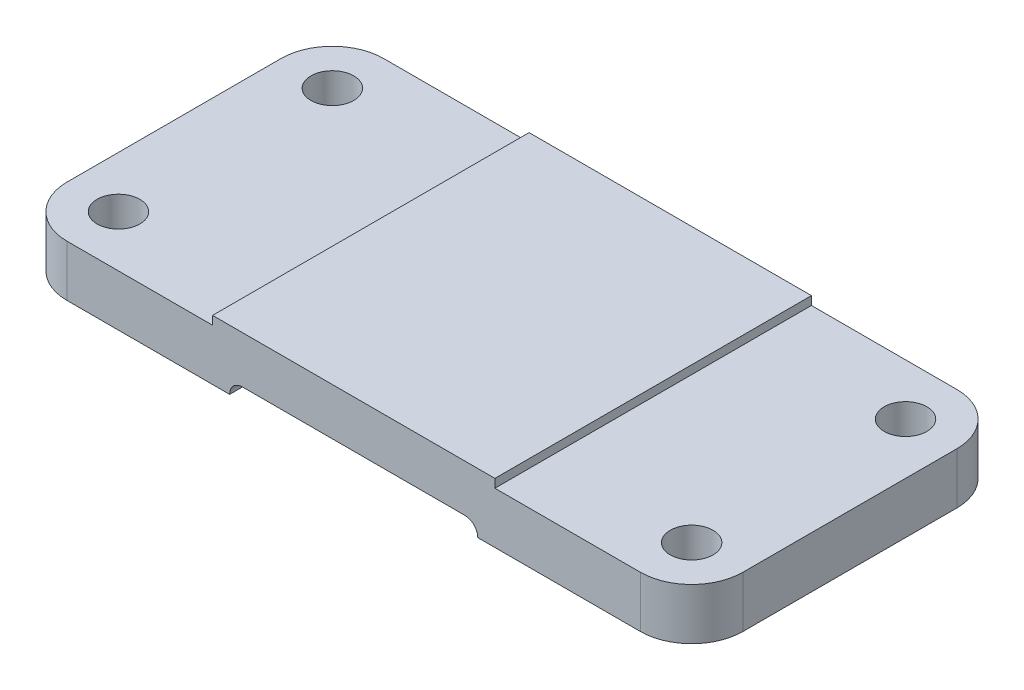
ISO-10303-21;
HEADER;
FILE_DESCRIPTION(('STEP AP214'),'2;1');
FILE_NAME('part.step','',(''),(''),'','','');
FILE_SCHEMA(('AUTOMOTIVE_DESIGN { 1 0 10303 214 1 1 1 1 }'));
ENDSEC;
DATA;
#1=APPLICATION_CONTEXT('core data for automotive mechanical design processes');
#2=APPLICATION_PROTOCOL_DEFINITION('international standard','automotive_design',2000,#1);
#3=PRODUCT_CONTEXT('',#1,'mechanical');
#4=PRODUCT('Part','Part','',(#3));
#5=PRODUCT_RELATED_PRODUCT_CATEGORY('part','',(#4));
#6=PRODUCT_DEFINITION_FORMATION('','',#4);
#7=PRODUCT_DEFINITION_CONTEXT('part definition',#1,'design');
#8=PRODUCT_DEFINITION('design','',#6,#7);
#9=PRODUCT_DEFINITION_SHAPE('','',#8);
#10=(LENGTH_UNIT() NAMED_UNIT(*) SI_UNIT(.MILLI.,.METRE.));
#11=(NAMED_UNIT(*) PLANE_ANGLE_UNIT() SI_UNIT($,.RADIAN.));
#12=(NAMED_UNIT(*) SI_UNIT($,.STERADIAN.) SOLID_ANGLE_UNIT());
#13=UNCERTAINTY_MEASURE_WITH_UNIT(LENGTH_MEASURE(1.E-05),#10,'distance_accuracy_value','');
#14=(GEOMETRIC_REPRESENTATION_CONTEXT(3) GLOBAL_UNCERTAINTY_ASSIGNED_CONTEXT((#13)) GLOBAL_UNIT_ASSIGNED_CONTEXT((#10,
#11,#12)) REPRESENTATION_CONTEXT('',''));
#15=CARTESIAN_POINT('',(0.,0.,0.));
#16=DIRECTION('',(0.,0.,1.));
#17=DIRECTION('',(1.,0.,0.));
#18=AXIS2_PLACEMENT_3D('',#15,#16,#17);
#19=CARTESIAN_POINT('',(-76.8652227671822,0.,33.9736268072995));
#20=DIRECTION('',(0.,1.,0.));
#21=DIRECTION('',(0.,0.,1.));
#22=AXIS2_PLACEMENT_3D('',#19,#20,#21);
#23=PLANE('',#22);
#24=CARTESIAN_POINT('',(57.1347772328178,0.,-16.0263731927005));
#25=DIRECTION('',(0.,1.,0.));
#26=DIRECTION('',(0.,0.,1.));
#27=AXIS2_PLACEMENT_3D('',#24,#25,#26);
#28=CIRCLE('',#27,5.00000000000001);
#29=CARTESIAN_POINT('',(57.1347772328178,0.,-11.0263731927005));
#30=VERTEX_POINT('',#29);
#31=EDGE_CURVE('E260',#30,#30,#28,.T.);
#32=ORIENTED_EDGE('',*,*,#31,.T.);
#33=EDGE_LOOP('',(#32));
#34=FACE_BOUND('',#33,.T.);
#35=CARTESIAN_POINT('',(57.1347772328178,0.,33.9736268072995));
#36=DIRECTION('',(0.,1.,0.));
#37=DIRECTION('',(0.,0.,1.));
#38=AXIS2_PLACEMENT_3D('',#35,#36,#37);
#39=CIRCLE('',#38,5.00000000000001);
#40=CARTESIAN_POINT('',(57.1347772328178,0.,38.9736268072995));
#41=VERTEX_POINT('',#40);
#42=EDGE_CURVE('E254',#41,#41,#39,.T.);
#43=ORIENTED_EDGE('',*,*,#42,.T.);
#44=EDGE_LOOP('',(#43));
#45=FACE_BOUND('',#44,.T.);
#46=DIRECTION('',(1.,0.,0.));
#47=VECTOR('',#46,1.);
#48=CARTESIAN_POINT('',(-76.8652227671821,0.,45.9736268072995));
#49=LINE('',#48,#47);
#50=CARTESIAN_POINT('',(19.1347772328178,0.,45.9736268072995));
#51=VERTEX_POINT('',#50);
#52=CARTESIAN_POINT('',(57.1347772328177,0.,45.9736268072995));
#53=VERTEX_POINT('',#52);
#54=EDGE_CURVE('E234',#51,#53,#49,.T.);
#55=ORIENTED_EDGE('',*,*,#54,.F.);
#56=DIRECTION('',(0.,0.,1.));
#57=VECTOR('',#56,1.);
#58=CARTESIAN_POINT('',(19.1347772328178,0.,45.9736268072995));
#59=LINE('',#58,#57);
#60=CARTESIAN_POINT('',(19.1347772328178,0.,-28.0263731927005));
#61=VERTEX_POINT('',#60);
#62=EDGE_CURVE('E170',#61,#51,#59,.T.);
#63=ORIENTED_EDGE('',*,*,#62,.F.);
#64=DIRECTION('',(-1.,0.,0.));
#65=VECTOR('',#64,1.);
#66=CARTESIAN_POINT('',(-76.8652227671821,0.,-28.0263731927005));
#67=LINE('',#66,#65);
#68=CARTESIAN_POINT('',(57.1347772328177,0.,-28.0263731927005));
#69=VERTEX_POINT('',#68);
#70=EDGE_CURVE('E164',#69,#61,#67,.T.);
#71=ORIENTED_EDGE('',*,*,#70,.F.);
#72=CARTESIAN_POINT('',(57.1347772328178,0.,-16.0263731927005));
#73=DIRECTION('',(0.,1.,0.));
#74=DIRECTION('',(0.,0.,1.));
#75=AXIS2_PLACEMENT_3D('',#72,#73,#74);
#76=CIRCLE('',#75,12.);
#77=CARTESIAN_POINT('',(69.1347772328178,0.,-16.0263731927004));
#78=VERTEX_POINT('',#77);
#79=EDGE_CURVE('E165',#78,#69,#76,.T.);
#80=ORIENTED_EDGE('',*,*,#79,.F.);
#81=DIRECTION('',(0.,0.,-1.));
#82=VECTOR('',#81,1.);
#83=CARTESIAN_POINT('',(69.1347772328178,0.,-16.0263731927004));
#84=LINE('',#83,#82);
#85=CARTESIAN_POINT('',(69.1347772328178,0.,33.9736268072994));
#86=VERTEX_POINT('',#85);
#87=EDGE_CURVE('E336',#86,#78,#84,.T.);
#88=ORIENTED_EDGE('',*,*,#87,.F.);
#89=CARTESIAN_POINT('',(57.1347772328178,0.,33.9736268072995));
#90=DIRECTION('',(0.,1.,0.));
#91=DIRECTION('',(0.,0.,1.));
#92=AXIS2_PLACEMENT_3D('',#89,#90,#91);
#93=CIRCLE('',#92,12.);
#94=EDGE_CURVE('E240',#53,#86,#93,.T.);
#95=ORIENTED_EDGE('',*,*,#94,.F.);
#96=EDGE_LOOP('',(#55,#63,#71,#80,#88,#95));
#97=FACE_BOUND('',#96,.T.);
#98=ADVANCED_FACE('F33',(#34,#45,#97),#23,.F.);
#99=CARTESIAN_POINT('',(-76.8652227671822,12.,33.9736268072995));
#100=DIRECTION('',(0.,1.,0.));
#101=DIRECTION('',(0.,0.,1.));
#102=AXIS2_PLACEMENT_3D('',#99,#100,#101);
#103=PLANE('',#102);
#104=CARTESIAN_POINT('',(57.1347772328178,12.,-16.0263731927005));
#105=DIRECTION('',(0.,1.,0.));
#106=DIRECTION('',(0.,0.,1.));
#107=AXIS2_PLACEMENT_3D('',#104,#105,#106);
#108=CIRCLE('',#107,5.00000000000001);
#109=CARTESIAN_POINT('',(57.1347772328178,12.,-11.0263731927005));
#110=VERTEX_POINT('',#109);
#111=EDGE_CURVE('E263',#110,#110,#108,.T.);
#112=ORIENTED_EDGE('',*,*,#111,.F.);
#113=EDGE_LOOP('',(#112));
#114=FACE_BOUND('',#113,.T.);
#115=CARTESIAN_POINT('',(57.1347772328178,12.,33.9736268072995));
#116=DIRECTION('',(0.,1.,0.));
#117=DIRECTION('',(0.,0.,1.));
#118=AXIS2_PLACEMENT_3D('',#115,#116,#117);
#119=CIRCLE('',#118,5.00000000000001);
#120=CARTESIAN_POINT('',(57.1347772328178,12.,38.9736268072995));
#121=VERTEX_POINT('',#120);
#122=EDGE_CURVE('E257',#121,#121,#119,.T.);
#123=ORIENTED_EDGE('',*,*,#122,.F.);
#124=EDGE_LOOP('',(#123));
#125=FACE_BOUND('',#124,.T.);
#126=DIRECTION('',(0.,0.,-1.));
#127=VECTOR('',#126,1.);
#128=CARTESIAN_POINT('',(23.1347772328178,12.,45.9736268072995));
#129=LINE('',#128,#127);
#130=CARTESIAN_POINT('',(23.1347772328178,12.,45.9736268072995));
#131=VERTEX_POINT('',#130);
#132=CARTESIAN_POINT('',(23.1347772328178,12.,-28.0263731927005));
#133=VERTEX_POINT('',#132);
#134=EDGE_CURVE('E184',#131,#133,#129,.T.);
#135=ORIENTED_EDGE('',*,*,#134,.F.);
#136=DIRECTION('',(1.,0.,0.));
#137=VECTOR('',#136,1.);
#138=CARTESIAN_POINT('',(-76.8652227671821,12.,45.9736268072995));
#139=LINE('',#138,#137);
#140=CARTESIAN_POINT('',(57.1347772328177,12.,45.9736268072995));
#141=VERTEX_POINT('',#140);
#142=EDGE_CURVE('E278',#131,#141,#139,.T.);
#143=ORIENTED_EDGE('',*,*,#142,.T.);
#144=CARTESIAN_POINT('',(57.1347772328178,12.,33.9736268072995));
#145=DIRECTION('',(0.,1.,0.));
#146=DIRECTION('',(0.,0.,1.));
#147=AXIS2_PLACEMENT_3D('',#144,#145,#146);
#148=CIRCLE('',#147,12.);
#149=CARTESIAN_POINT('',(69.1347772328178,12.,33.9736268072994));
#150=VERTEX_POINT('',#149);
#151=EDGE_CURVE('E312',#141,#150,#148,.T.);
#152=ORIENTED_EDGE('',*,*,#151,.T.);
#153=DIRECTION('',(0.,0.,-1.));
#154=VECTOR('',#153,1.);
#155=CARTESIAN_POINT('',(69.1347772328178,12.,-16.0263731927004));
#156=LINE('',#155,#154);
#157=CARTESIAN_POINT('',(69.1347772328178,12.,-16.0263731927004));
#158=VERTEX_POINT('',#157);
#159=EDGE_CURVE('E308',#150,#158,#156,.T.);
#160=ORIENTED_EDGE('',*,*,#159,.T.);
#161=CARTESIAN_POINT('',(57.1347772328178,12.,-16.0263731927005));
#162=DIRECTION('',(0.,1.,0.));
#163=DIRECTION('',(0.,0.,1.));
#164=AXIS2_PLACEMENT_3D('',#161,#162,#163);
#165=CIRCLE('',#164,12.);
#166=CARTESIAN_POINT('',(57.1347772328177,12.,-28.0263731927005));
#167=VERTEX_POINT('',#166);
#168=EDGE_CURVE('E306',#158,#167,#165,.T.);
#169=ORIENTED_EDGE('',*,*,#168,.T.);
#170=DIRECTION('',(-1.,0.,0.));
#171=VECTOR('',#170,1.);
#172=CARTESIAN_POINT('',(-76.8652227671821,12.,-28.0263731927005));
#173=LINE('',#172,#171);
#174=EDGE_CURVE('E280',#167,#133,#173,.T.);
#175=ORIENTED_EDGE('',*,*,#174,.T.);
#176=EDGE_LOOP('',(#135,#143,#152,#160,#169,#175));
#177=FACE_BOUND('',#176,.T.);
#178=ADVANCED_FACE('F269',(#114,#125,#177),#103,.T.);
#179=CARTESIAN_POINT('',(-76.8652227671822,12.,33.9736268072995));
#180=DIRECTION('',(0.,-1.,0.));
#181=DIRECTION('',(0.,0.,-1.));
#182=AXIS2_PLACEMENT_3D('',#179,#180,#181);
#183=CYLINDRICAL_SURFACE('',#182,12.);
#184=CARTESIAN_POINT('',(-76.8652227671822,0.,33.9736268072995));
#185=DIRECTION('',(0.,1.,0.));
#186=DIRECTION('',(0.,0.,1.));
#187=AXIS2_PLACEMENT_3D('',#184,#185,#186);
#188=CIRCLE('',#187,12.);
#189=CARTESIAN_POINT('',(-88.8652227671822,0.,33.9736268072994));
#190=VERTEX_POINT('',#189);
#191=CARTESIAN_POINT('',(-76.8652227671821,0.,45.9736268072995));
#192=VERTEX_POINT('',#191);
#193=EDGE_CURVE('E212',#190,#192,#188,.T.);
#194=ORIENTED_EDGE('',*,*,#193,.T.);
#195=DIRECTION('',(0.,-1.,0.));
#196=VECTOR('',#195,1.);
#197=CARTESIAN_POINT('',(-76.8652227671821,12.,45.9736268072995));
#198=LINE('',#197,#196);
#199=CARTESIAN_POINT('',(-76.8652227671821,12.,45.9736268072995));
#200=VERTEX_POINT('',#199);
#201=EDGE_CURVE('E225',#200,#192,#198,.T.);
#202=ORIENTED_EDGE('',*,*,#201,.F.);
#203=CARTESIAN_POINT('',(-76.8652227671822,12.,33.9736268072995));
#204=DIRECTION('',(0.,1.,0.));
#205=DIRECTION('',(0.,0.,1.));
#206=AXIS2_PLACEMENT_3D('',#203,#204,#205);
#207=CIRCLE('',#206,12.);
#208=CARTESIAN_POINT('',(-88.8652227671822,12.,33.9736268072994));
#209=VERTEX_POINT('',#208);
#210=EDGE_CURVE('E289',#209,#200,#207,.T.);
#211=ORIENTED_EDGE('',*,*,#210,.F.);
#212=DIRECTION('',(0.,-1.,0.));
#213=VECTOR('',#212,1.);
#214=CARTESIAN_POINT('',(-88.8652227671822,12.,33.9736268072994));
#215=LINE('',#214,#213);
#216=EDGE_CURVE('E355',#209,#190,#215,.T.);
#217=ORIENTED_EDGE('',*,*,#216,.T.);
#218=EDGE_LOOP('',(#194,#202,#211,#217));
#219=FACE_BOUND('',#218,.T.);
#220=ADVANCED_FACE('F272',(#219),#183,.T.);
#221=CARTESIAN_POINT('',(-76.8652227671821,12.,45.9736268072995));
#222=DIRECTION('',(0.,0.,-1.));
#223=DIRECTION('',(-1.,0.,0.));
#224=AXIS2_PLACEMENT_3D('',#221,#222,#223);
#225=PLANE('',#224);
#226=DIRECTION('',(-1.,0.,0.));
#227=VECTOR('',#226,1.);
#228=CARTESIAN_POINT('',(-9.86522276718223,3.,45.9736268072995));
#229=LINE('',#228,#227);
#230=CARTESIAN_POINT('',(16.1347772328178,3.,45.9736268072995));
#231=VERTEX_POINT('',#230);
#232=CARTESIAN_POINT('',(-35.8652227671822,3.,45.9736268072995));
#233=VERTEX_POINT('',#232);
#234=EDGE_CURVE('E173',#231,#233,#229,.T.);
#235=ORIENTED_EDGE('',*,*,#234,.F.);
#236=CARTESIAN_POINT('',(16.1347772328178,0.,45.9736268072995));
#237=DIRECTION('',(0.,0.,-1.));
#238=DIRECTION('',(-1.,0.,0.));
#239=AXIS2_PLACEMENT_3D('',#236,#237,#238);
#240=CIRCLE('',#239,3.);
#241=EDGE_CURVE('E41',#231,#51,#240,.T.);
#242=ORIENTED_EDGE('',*,*,#241,.T.);
#243=ORIENTED_EDGE('',*,*,#54,.T.);
#244=DIRECTION('',(0.,-1.,0.));
#245=VECTOR('',#244,1.);
#246=CARTESIAN_POINT('',(57.1347772328177,12.,45.9736268072995));
#247=LINE('',#246,#245);
#248=EDGE_CURVE('E286',#141,#53,#247,.T.);
#249=ORIENTED_EDGE('',*,*,#248,.F.);
#250=ORIENTED_EDGE('',*,*,#142,.F.);
#251=DIRECTION('',(0.,-1.,0.));
#252=VECTOR('',#251,1.);
#253=CARTESIAN_POINT('',(23.1347772328178,14.,45.9736268072995));
#254=LINE('',#253,#252);
#255=CARTESIAN_POINT('',(23.1347772328178,14.,45.9736268072995));
#256=VERTEX_POINT('',#255);
#257=EDGE_CURVE('E207',#256,#131,#254,.T.);
#258=ORIENTED_EDGE('',*,*,#257,.F.);
#259=DIRECTION('',(1.,0.,0.));
#260=VECTOR('',#259,1.);
#261=CARTESIAN_POINT('',(-42.8652227671822,14.,45.9736268072995));
#262=LINE('',#261,#260);
#263=CARTESIAN_POINT('',(-42.8652227671822,14.,45.9736268072995));
#264=VERTEX_POINT('',#263);
#265=EDGE_CURVE('E186',#264,#256,#262,.T.);
#266=ORIENTED_EDGE('',*,*,#265,.F.);
#267=DIRECTION('',(0.,-1.,0.));
#268=VECTOR('',#267,1.);
#269=CARTESIAN_POINT('',(-42.8652227671822,14.,45.9736268072995));
#270=LINE('',#269,#268);
#271=CARTESIAN_POINT('',(-42.8652227671822,12.,45.9736268072995));
#272=VERTEX_POINT('',#271);
#273=EDGE_CURVE('E203',#264,#272,#270,.T.);
#274=ORIENTED_EDGE('',*,*,#273,.T.);
#275=EDGE_CURVE('E288',#200,#272,#139,.T.);
#276=ORIENTED_EDGE('',*,*,#275,.F.);
#277=ORIENTED_EDGE('',*,*,#201,.T.);
#278=CARTESIAN_POINT('',(-38.8652227671822,0.,45.9736268072995));
#279=VERTEX_POINT('',#278);
#280=EDGE_CURVE('E241',#192,#279,#49,.T.);
#281=ORIENTED_EDGE('',*,*,#280,.T.);
#282=CARTESIAN_POINT('',(-35.8652227671822,0.,45.9736268072995));
#283=DIRECTION('',(0.,0.,-1.));
#284=DIRECTION('',(-1.,0.,0.));
#285=AXIS2_PLACEMENT_3D('',#282,#283,#284);
#286=CIRCLE('',#285,3.);
#287=EDGE_CURVE('E154',#279,#233,#286,.T.);
#288=ORIENTED_EDGE('',*,*,#287,.T.);
#289=EDGE_LOOP('',(#235,#242,#243,#249,#250,#258,#266,#274,#276,#277,#281,#288));
#290=FACE_BOUND('',#289,.T.);
#291=ADVANCED_FACE('F232',(#290),#225,.F.);
#292=CARTESIAN_POINT('',(57.1347772328178,12.,33.9736268072995));
#293=DIRECTION('',(0.,-1.,0.));
#294=DIRECTION('',(0.,0.,-1.));
#295=AXIS2_PLACEMENT_3D('',#292,#293,#294);
#296=CYLINDRICAL_SURFACE('',#295,12.);
#297=ORIENTED_EDGE('',*,*,#94,.T.);
#298=DIRECTION('',(0.,-1.,0.));
#299=VECTOR('',#298,1.);
#300=CARTESIAN_POINT('',(69.1347772328178,12.,33.9736268072994));
#301=LINE('',#300,#299);
#302=EDGE_CURVE('E329',#150,#86,#301,.T.);
#303=ORIENTED_EDGE('',*,*,#302,.F.);
#304=ORIENTED_EDGE('',*,*,#151,.F.);
#305=ORIENTED_EDGE('',*,*,#248,.T.);
#306=EDGE_LOOP('',(#297,#303,#304,#305));
#307=FACE_BOUND('',#306,.T.);
#308=ADVANCED_FACE('F330',(#307),#296,.T.);
#309=CARTESIAN_POINT('',(69.1347772328178,12.,-16.0263731927004));
#310=DIRECTION('',(-1.,0.,0.));
#311=DIRECTION('',(0.,0.,1.));
#312=AXIS2_PLACEMENT_3D('',#309,#310,#311);
#313=PLANE('',#312);
#314=ORIENTED_EDGE('',*,*,#87,.T.);
#315=DIRECTION('',(0.,-1.,0.));
#316=VECTOR('',#315,1.);
#317=CARTESIAN_POINT('',(69.1347772328178,12.,-16.0263731927004));
#318=LINE('',#317,#316);
#319=EDGE_CURVE('E332',#158,#78,#318,.T.);
#320=ORIENTED_EDGE('',*,*,#319,.F.);
#321=ORIENTED_EDGE('',*,*,#159,.F.);
#322=ORIENTED_EDGE('',*,*,#302,.T.);
#323=EDGE_LOOP('',(#314,#320,#321,#322));
#324=FACE_BOUND('',#323,.T.);
#325=ADVANCED_FACE('F334',(#324),#313,.F.);
#326=CARTESIAN_POINT('',(57.1347772328178,12.,-16.0263731927005));
#327=DIRECTION('',(0.,-1.,0.));
#328=DIRECTION('',(0.,0.,-1.));
#329=AXIS2_PLACEMENT_3D('',#326,#327,#328);
#330=CYLINDRICAL_SURFACE('',#329,12.);
#331=ORIENTED_EDGE('',*,*,#79,.T.);
#332=DIRECTION('',(0.,-1.,0.));
#333=VECTOR('',#332,1.);
#334=CARTESIAN_POINT('',(57.1347772328177,12.,-28.0263731927005));
#335=LINE('',#334,#333);
#336=EDGE_CURVE('E339',#167,#69,#335,.T.);
#337=ORIENTED_EDGE('',*,*,#336,.F.);
#338=ORIENTED_EDGE('',*,*,#168,.F.);
#339=ORIENTED_EDGE('',*,*,#319,.T.);
#340=EDGE_LOOP('',(#331,#337,#338,#339));
#341=FACE_BOUND('',#340,.T.);
#342=ADVANCED_FACE('F341',(#341),#330,.T.);
#343=CARTESIAN_POINT('',(-76.8652227671821,12.,-28.0263731927005));
#344=DIRECTION('',(0.,0.,1.));
#345=DIRECTION('',(1.,0.,0.));
#346=AXIS2_PLACEMENT_3D('',#343,#344,#345);
#347=PLANE('',#346);
#348=ORIENTED_EDGE('',*,*,#70,.T.);
#349=CARTESIAN_POINT('',(16.1347772328178,0.,-28.0263731927005));
#350=DIRECTION('',(0.,0.,1.));
#351=DIRECTION('',(1.,0.,0.));
#352=AXIS2_PLACEMENT_3D('',#349,#350,#351);
#353=CIRCLE('',#352,3.);
#354=CARTESIAN_POINT('',(16.1347772328178,3.,-28.0263731927005));
#355=VERTEX_POINT('',#354);
#356=EDGE_CURVE('E11',#61,#355,#353,.T.);
#357=ORIENTED_EDGE('',*,*,#356,.T.);
#358=DIRECTION('',(1.,0.,0.));
#359=VECTOR('',#358,1.);
#360=CARTESIAN_POINT('',(19.1347772328178,3.,-28.0263731927005));
#361=LINE('',#360,#359);
#362=CARTESIAN_POINT('',(-35.8652227671822,3.,-28.0263731927005));
#363=VERTEX_POINT('',#362);
#364=EDGE_CURVE('E149',#363,#355,#361,.T.);
#365=ORIENTED_EDGE('',*,*,#364,.F.);
#366=CARTESIAN_POINT('',(-35.8652227671822,0.,-28.0263731927005));
#367=DIRECTION('',(0.,0.,1.));
#368=DIRECTION('',(1.,0.,0.));
#369=AXIS2_PLACEMENT_3D('',#366,#367,#368);
#370=CIRCLE('',#369,3.);
#371=CARTESIAN_POINT('',(-38.8652227671822,0.,-28.0263731927005));
#372=VERTEX_POINT('',#371);
#373=EDGE_CURVE('E143',#363,#372,#370,.T.);
#374=ORIENTED_EDGE('',*,*,#373,.T.);
#375=CARTESIAN_POINT('',(-76.8652227671821,0.,-28.0263731927005));
#376=VERTEX_POINT('',#375);
#377=EDGE_CURVE('E147',#372,#376,#67,.T.);
#378=ORIENTED_EDGE('',*,*,#377,.T.);
#379=DIRECTION('',(0.,-1.,0.));
#380=VECTOR('',#379,1.);
#381=CARTESIAN_POINT('',(-76.8652227671821,12.,-28.0263731927005));
#382=LINE('',#381,#380);
#383=CARTESIAN_POINT('',(-76.8652227671821,12.,-28.0263731927005));
#384=VERTEX_POINT('',#383);
#385=EDGE_CURVE('E304',#384,#376,#382,.T.);
#386=ORIENTED_EDGE('',*,*,#385,.F.);
#387=CARTESIAN_POINT('',(-42.8652227671822,12.,-28.0263731927005));
#388=VERTEX_POINT('',#387);
#389=EDGE_CURVE('E200',#388,#384,#173,.T.);
#390=ORIENTED_EDGE('',*,*,#389,.F.);
#391=DIRECTION('',(0.,-1.,0.));
#392=VECTOR('',#391,1.);
#393=CARTESIAN_POINT('',(-42.8652227671822,14.,-28.0263731927005));
#394=LINE('',#393,#392);
#395=CARTESIAN_POINT('',(-42.8652227671822,14.,-28.0263731927005));
#396=VERTEX_POINT('',#395);
#397=EDGE_CURVE('E206',#396,#388,#394,.T.);
#398=ORIENTED_EDGE('',*,*,#397,.F.);
#399=DIRECTION('',(-1.,0.,0.));
#400=VECTOR('',#399,1.);
#401=CARTESIAN_POINT('',(-9.86522276718222,14.,-28.0263731927005));
#402=LINE('',#401,#400);
#403=CARTESIAN_POINT('',(23.1347772328178,14.,-28.0263731927005));
#404=VERTEX_POINT('',#403);
#405=EDGE_CURVE('E181',#404,#396,#402,.T.);
#406=ORIENTED_EDGE('',*,*,#405,.F.);
#407=DIRECTION('',(0.,-1.,0.));
#408=VECTOR('',#407,1.);
#409=CARTESIAN_POINT('',(23.1347772328178,14.,-28.0263731927005));
#410=LINE('',#409,#408);
#411=EDGE_CURVE('E190',#404,#133,#410,.T.);
#412=ORIENTED_EDGE('',*,*,#411,.T.);
#413=ORIENTED_EDGE('',*,*,#174,.F.);
#414=ORIENTED_EDGE('',*,*,#336,.T.);
#415=EDGE_LOOP('',(#348,#357,#365,#374,#378,#386,#390,#398,#406,#412,#413,#414));
#416=FACE_BOUND('',#415,.T.);
#417=ADVANCED_FACE('F145',(#416),#347,.F.);
#418=CARTESIAN_POINT('',(-76.8652227671822,12.,-16.0263731927005));
#419=DIRECTION('',(0.,-1.,0.));
#420=DIRECTION('',(0.,0.,-1.));
#421=AXIS2_PLACEMENT_3D('',#418,#419,#420);
#422=CYLINDRICAL_SURFACE('',#421,12.);
#423=CARTESIAN_POINT('',(-76.8652227671822,0.,-16.0263731927005));
#424=DIRECTION('',(0.,1.,0.));
#425=DIRECTION('',(0.,0.,-1.));
#426=AXIS2_PLACEMENT_3D('',#423,#424,#425);
#427=CIRCLE('',#426,12.);
#428=CARTESIAN_POINT('',(-88.8652227671822,0.,-16.0263731927004));
#429=VERTEX_POINT('',#428);
#430=EDGE_CURVE('E163',#376,#429,#427,.T.);
#431=ORIENTED_EDGE('',*,*,#430,.T.);
#432=DIRECTION('',(0.,-1.,0.));
#433=VECTOR('',#432,1.);
#434=CARTESIAN_POINT('',(-88.8652227671822,12.,-16.0263731927004));
#435=LINE('',#434,#433);
#436=CARTESIAN_POINT('',(-88.8652227671822,12.,-16.0263731927004));
#437=VERTEX_POINT('',#436);
#438=EDGE_CURVE('E344',#437,#429,#435,.T.);
#439=ORIENTED_EDGE('',*,*,#438,.F.);
#440=CARTESIAN_POINT('',(-76.8652227671822,12.,-16.0263731927005));
#441=DIRECTION('',(0.,1.,0.));
#442=DIRECTION('',(0.,0.,-1.));
#443=AXIS2_PLACEMENT_3D('',#440,#441,#442);
#444=CIRCLE('',#443,12.);
#445=EDGE_CURVE('E307',#384,#437,#444,.T.);
#446=ORIENTED_EDGE('',*,*,#445,.F.);
#447=ORIENTED_EDGE('',*,*,#385,.T.);
#448=EDGE_LOOP('',(#431,#439,#446,#447));
#449=FACE_BOUND('',#448,.T.);
#450=ADVANCED_FACE('F371',(#449),#422,.T.);
#451=CARTESIAN_POINT('',(-88.8652227671822,12.,-16.0263731927004));
#452=DIRECTION('',(1.,0.,0.));
#453=DIRECTION('',(0.,0.,-1.));
#454=AXIS2_PLACEMENT_3D('',#451,#452,#453);
#455=PLANE('',#454);
#456=DIRECTION('',(0.,0.,1.));
#457=VECTOR('',#456,1.);
#458=CARTESIAN_POINT('',(-88.8652227671822,0.,-16.0263731927004));
#459=LINE('',#458,#457);
#460=EDGE_CURVE('E363',#429,#190,#459,.T.);
#461=ORIENTED_EDGE('',*,*,#460,.T.);
#462=ORIENTED_EDGE('',*,*,#216,.F.);
#463=DIRECTION('',(0.,0.,1.));
#464=VECTOR('',#463,1.);
#465=CARTESIAN_POINT('',(-88.8652227671822,12.,-16.0263731927004));
#466=LINE('',#465,#464);
#467=EDGE_CURVE('E357',#437,#209,#466,.T.);
#468=ORIENTED_EDGE('',*,*,#467,.F.);
#469=ORIENTED_EDGE('',*,*,#438,.T.);
#470=EDGE_LOOP('',(#461,#462,#468,#469));
#471=FACE_BOUND('',#470,.T.);
#472=ADVANCED_FACE('F369',(#471),#455,.F.);
#473=CARTESIAN_POINT('',(-76.8652227671822,12.,33.9736268072995));
#474=DIRECTION('',(0.,1.,0.));
#475=DIRECTION('',(0.,0.,1.));
#476=AXIS2_PLACEMENT_3D('',#473,#474,#475);
#477=CIRCLE('',#476,5.00000000000002);
#478=CARTESIAN_POINT('',(-76.8652227671822,12.,38.9736268072995));
#479=VERTEX_POINT('',#478);
#480=EDGE_CURVE('E251',#479,#479,#477,.T.);
#481=ORIENTED_EDGE('',*,*,#480,.F.);
#482=EDGE_LOOP('',(#481));
#483=FACE_BOUND('',#482,.T.);
#484=CARTESIAN_POINT('',(-76.8652227671822,12.,-16.0263731927005));
#485=DIRECTION('',(0.,1.,0.));
#486=DIRECTION('',(0.,0.,1.));
#487=AXIS2_PLACEMENT_3D('',#484,#485,#486);
#488=CIRCLE('',#487,5.00000000000002);
#489=CARTESIAN_POINT('',(-76.8652227671822,12.,-11.0263731927005));
#490=VERTEX_POINT('',#489);
#491=EDGE_CURVE('E176',#490,#490,#488,.T.);
#492=ORIENTED_EDGE('',*,*,#491,.F.);
#493=EDGE_LOOP('',(#492));
#494=FACE_BOUND('',#493,.T.);
#495=DIRECTION('',(0.,0.,1.));
#496=VECTOR('',#495,1.);
#497=CARTESIAN_POINT('',(-42.8652227671822,12.,-28.0263731927005));
#498=LINE('',#497,#496);
#499=EDGE_CURVE('E196',#388,#272,#498,.T.);
#500=ORIENTED_EDGE('',*,*,#499,.F.);
#501=ORIENTED_EDGE('',*,*,#389,.T.);
#502=ORIENTED_EDGE('',*,*,#445,.T.);
#503=ORIENTED_EDGE('',*,*,#467,.T.);
#504=ORIENTED_EDGE('',*,*,#210,.T.);
#505=ORIENTED_EDGE('',*,*,#275,.T.);
#506=EDGE_LOOP('',(#500,#501,#502,#503,#504,#505));
#507=FACE_BOUND('',#506,.T.);
#508=ADVANCED_FACE('F274',(#483,#494,#507),#103,.T.);
#509=CARTESIAN_POINT('',(-76.8652227671822,0.,33.9736268072995));
#510=DIRECTION('',(0.,1.,0.));
#511=DIRECTION('',(0.,0.,1.));
#512=AXIS2_PLACEMENT_3D('',#509,#510,#511);
#513=CIRCLE('',#512,5.);
#514=CARTESIAN_POINT('',(-76.8652227671822,0.,38.9736268072995));
#515=VERTEX_POINT('',#514);
#516=EDGE_CURVE('E248',#515,#515,#513,.T.);
#517=ORIENTED_EDGE('',*,*,#516,.T.);
#518=EDGE_LOOP('',(#517));
#519=FACE_BOUND('',#518,.T.);
#520=CARTESIAN_POINT('',(-76.8652227671822,0.,-16.0263731927005));
#521=DIRECTION('',(0.,1.,0.));
#522=DIRECTION('',(0.,0.,1.));
#523=AXIS2_PLACEMENT_3D('',#520,#521,#522);
#524=CIRCLE('',#523,5.00000000000002);
#525=CARTESIAN_POINT('',(-76.8652227671822,0.,-11.0263731927005));
#526=VERTEX_POINT('',#525);
#527=EDGE_CURVE('E171',#526,#526,#524,.T.);
#528=ORIENTED_EDGE('',*,*,#527,.T.);
#529=EDGE_LOOP('',(#528));
#530=FACE_BOUND('',#529,.T.);
#531=ORIENTED_EDGE('',*,*,#377,.F.);
#532=DIRECTION('',(0.,0.,-1.));
#533=VECTOR('',#532,1.);
#534=CARTESIAN_POINT('',(-38.8652227671822,0.,45.9736268072995));
#535=LINE('',#534,#533);
#536=EDGE_CURVE('E160',#279,#372,#535,.T.);
#537=ORIENTED_EDGE('',*,*,#536,.F.);
#538=ORIENTED_EDGE('',*,*,#280,.F.);
#539=ORIENTED_EDGE('',*,*,#193,.F.);
#540=ORIENTED_EDGE('',*,*,#460,.F.);
#541=ORIENTED_EDGE('',*,*,#430,.F.);
#542=EDGE_LOOP('',(#531,#537,#538,#539,#540,#541));
#543=FACE_BOUND('',#542,.T.);
#544=ADVANCED_FACE('F159',(#519,#530,#543),#23,.F.);
#545=CARTESIAN_POINT('',(-42.8652227671822,14.,-28.0263731927005));
#546=DIRECTION('',(1.,0.,0.));
#547=DIRECTION('',(0.,0.,-1.));
#548=AXIS2_PLACEMENT_3D('',#545,#546,#547);
#549=PLANE('',#548);
#550=ORIENTED_EDGE('',*,*,#499,.T.);
#551=ORIENTED_EDGE('',*,*,#273,.F.);
#552=DIRECTION('',(0.,0.,1.));
#553=VECTOR('',#552,1.);
#554=CARTESIAN_POINT('',(-42.8652227671822,14.,-28.0263731927005));
#555=LINE('',#554,#553);
#556=EDGE_CURVE('E183',#396,#264,#555,.T.);
#557=ORIENTED_EDGE('',*,*,#556,.F.);
#558=ORIENTED_EDGE('',*,*,#397,.T.);
#559=EDGE_LOOP('',(#550,#551,#557,#558));
#560=FACE_BOUND('',#559,.T.);
#561=ADVANCED_FACE('F301',(#560),#549,.F.);
#562=CARTESIAN_POINT('',(23.1347772328178,14.,45.9736268072995));
#563=DIRECTION('',(-1.,0.,0.));
#564=DIRECTION('',(0.,0.,1.));
#565=AXIS2_PLACEMENT_3D('',#562,#563,#564);
#566=PLANE('',#565);
#567=ORIENTED_EDGE('',*,*,#134,.T.);
#568=ORIENTED_EDGE('',*,*,#411,.F.);
#569=DIRECTION('',(0.,0.,-1.));
#570=VECTOR('',#569,1.);
#571=CARTESIAN_POINT('',(23.1347772328178,14.,45.9736268072995));
#572=LINE('',#571,#570);
#573=EDGE_CURVE('E188',#256,#404,#572,.T.);
#574=ORIENTED_EDGE('',*,*,#573,.F.);
#575=ORIENTED_EDGE('',*,*,#257,.T.);
#576=EDGE_LOOP('',(#567,#568,#574,#575));
#577=FACE_BOUND('',#576,.T.);
#578=ADVANCED_FACE('F291',(#577),#566,.F.);
#579=CARTESIAN_POINT('',(23.1347772328178,14.,-28.0263731927005));
#580=DIRECTION('',(0.,1.,0.));
#581=DIRECTION('',(0.,0.,1.));
#582=AXIS2_PLACEMENT_3D('',#579,#580,#581);
#583=PLANE('',#582);
#584=ORIENTED_EDGE('',*,*,#405,.T.);
#585=ORIENTED_EDGE('',*,*,#556,.T.);
#586=ORIENTED_EDGE('',*,*,#265,.T.);
#587=ORIENTED_EDGE('',*,*,#573,.T.);
#588=EDGE_LOOP('',(#584,#585,#586,#587));
#589=FACE_BOUND('',#588,.T.);
#590=ADVANCED_FACE('F294',(#589),#583,.T.);
#591=CARTESIAN_POINT('',(-38.8652227671822,3.,45.9736268072995));
#592=DIRECTION('',(0.,-1.,0.));
#593=DIRECTION('',(0.,0.,-1.));
#594=AXIS2_PLACEMENT_3D('',#591,#592,#593);
#595=PLANE('',#594);
#596=ORIENTED_EDGE('',*,*,#364,.T.);
#597=DIRECTION('',(0.,0.,1.));
#598=VECTOR('',#597,1.);
#599=CARTESIAN_POINT('',(16.1347772328178,3.,45.9736268072995));
#600=LINE('',#599,#598);
#601=EDGE_CURVE('E228',#355,#231,#600,.T.);
#602=ORIENTED_EDGE('',*,*,#601,.T.);
#603=ORIENTED_EDGE('',*,*,#234,.T.);
#604=DIRECTION('',(0.,0.,-1.));
#605=VECTOR('',#604,1.);
#606=CARTESIAN_POINT('',(-35.8652227671822,3.,45.9736268072995));
#607=LINE('',#606,#605);
#608=EDGE_CURVE('E155',#233,#363,#607,.T.);
#609=ORIENTED_EDGE('',*,*,#608,.T.);
#610=EDGE_LOOP('',(#596,#602,#603,#609));
#611=FACE_BOUND('',#610,.T.);
#612=ADVANCED_FACE('F244',(#611),#595,.T.);
#613=CARTESIAN_POINT('',(-35.8652227671822,0.,45.9736268072995));
#614=DIRECTION('',(0.,0.,-1.));
#615=DIRECTION('',(-1.,0.,0.));
#616=AXIS2_PLACEMENT_3D('',#613,#614,#615);
#617=CYLINDRICAL_SURFACE('',#616,3.);
#618=ORIENTED_EDGE('',*,*,#287,.F.);
#619=ORIENTED_EDGE('',*,*,#536,.T.);
#620=ORIENTED_EDGE('',*,*,#373,.F.);
#621=ORIENTED_EDGE('',*,*,#608,.F.);
#622=EDGE_LOOP('',(#618,#619,#620,#621));
#623=FACE_BOUND('',#622,.T.);
#624=ADVANCED_FACE('F168',(#623),#617,.F.);
#625=CARTESIAN_POINT('',(16.1347772328178,0.,45.9736268072995));
#626=DIRECTION('',(0.,0.,1.));
#627=DIRECTION('',(1.,0.,0.));
#628=AXIS2_PLACEMENT_3D('',#625,#626,#627);
#629=CYLINDRICAL_SURFACE('',#628,3.);
#630=ORIENTED_EDGE('',*,*,#356,.F.);
#631=ORIENTED_EDGE('',*,*,#62,.T.);
#632=ORIENTED_EDGE('',*,*,#241,.F.);
#633=ORIENTED_EDGE('',*,*,#601,.F.);
#634=EDGE_LOOP('',(#630,#631,#632,#633));
#635=FACE_BOUND('',#634,.T.);
#636=ADVANCED_FACE('F35',(#635),#629,.F.);
#637=CARTESIAN_POINT('',(-76.8652227671822,12.,-16.0263731927005));
#638=DIRECTION('',(0.,1.,0.));
#639=DIRECTION('',(0.,0.,1.));
#640=AXIS2_PLACEMENT_3D('',#637,#638,#639);
#641=CYLINDRICAL_SURFACE('',#640,5.00000000000002);
#642=ORIENTED_EDGE('',*,*,#527,.F.);
#643=EDGE_LOOP('',(#642));
#644=FACE_BOUND('',#643,.T.);
#645=ORIENTED_EDGE('',*,*,#491,.T.);
#646=EDGE_LOOP('',(#645));
#647=FACE_BOUND('',#646,.T.);
#648=ADVANCED_FACE('F398',(#644,#647),#641,.F.);
#649=CARTESIAN_POINT('',(-76.8652227671822,12.,33.9736268072995));
#650=DIRECTION('',(0.,1.,0.));
#651=DIRECTION('',(0.,0.,1.));
#652=AXIS2_PLACEMENT_3D('',#649,#650,#651);
#653=CYLINDRICAL_SURFACE('',#652,5.00000000000001);
#654=ORIENTED_EDGE('',*,*,#516,.F.);
#655=EDGE_LOOP('',(#654));
#656=FACE_BOUND('',#655,.T.);
#657=ORIENTED_EDGE('',*,*,#480,.T.);
#658=EDGE_LOOP('',(#657));
#659=FACE_BOUND('',#658,.T.);
#660=ADVANCED_FACE('F401',(#656,#659),#653,.F.);
#661=CARTESIAN_POINT('',(57.1347772328178,12.,33.9736268072995));
#662=DIRECTION('',(0.,1.,0.));
#663=DIRECTION('',(0.,0.,1.));
#664=AXIS2_PLACEMENT_3D('',#661,#662,#663);
#665=CYLINDRICAL_SURFACE('',#664,5.00000000000001);
#666=ORIENTED_EDGE('',*,*,#42,.F.);
#667=EDGE_LOOP('',(#666));
#668=FACE_BOUND('',#667,.T.);
#669=ORIENTED_EDGE('',*,*,#122,.T.);
#670=EDGE_LOOP('',(#669));
#671=FACE_BOUND('',#670,.T.);
#672=ADVANCED_FACE('F409',(#668,#671),#665,.F.);
#673=CARTESIAN_POINT('',(57.1347772328178,12.,-16.0263731927005));
#674=DIRECTION('',(0.,1.,0.));
#675=DIRECTION('',(0.,0.,1.));
#676=AXIS2_PLACEMENT_3D('',#673,#674,#675);
#677=CYLINDRICAL_SURFACE('',#676,5.00000000000001);
#678=ORIENTED_EDGE('',*,*,#31,.F.);
#679=EDGE_LOOP('',(#678));
#680=FACE_BOUND('',#679,.T.);
#681=ORIENTED_EDGE('',*,*,#111,.T.);
#682=EDGE_LOOP('',(#681));
#683=FACE_BOUND('',#682,.T.);
#684=ADVANCED_FACE('F267',(#680,#683),#677,.F.);
#685=CLOSED_SHELL('',(#98,#178,#220,#291,#308,#325,#342,#417,#450,#472,#508,#544,#561,#578,#590,
#612,#624,#636,#648,#660,#672,#684));
#686=MANIFOLD_SOLID_BREP('B2',#685);
#687=ADVANCED_BREP_SHAPE_REPRESENTATION('',(#18,#686),#14);
#688=SHAPE_DEFINITION_REPRESENTATION(#9,#687);
ENDSEC;
END-ISO-10303-21;
